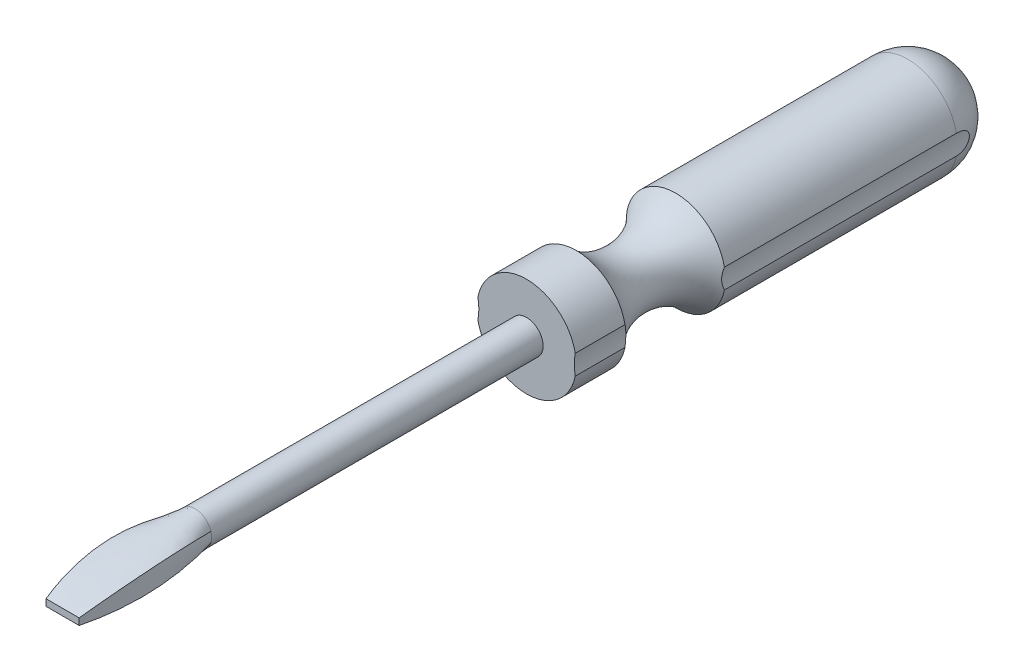
ISO-10303-21;
HEADER;
FILE_DESCRIPTION(('STEP AP214'),'2;1');
FILE_NAME('part.step','',(''),(''),'','','');
FILE_SCHEMA(('AUTOMOTIVE_DESIGN { 1 0 10303 214 1 1 1 1 }'));
ENDSEC;
DATA;
#1=APPLICATION_CONTEXT('core data for automotive mechanical design processes');
#2=APPLICATION_PROTOCOL_DEFINITION('international standard','automotive_design',2000,#1);
#3=PRODUCT_CONTEXT('',#1,'mechanical');
#4=PRODUCT('Part','Part','',(#3));
#5=PRODUCT_RELATED_PRODUCT_CATEGORY('part','',(#4));
#6=PRODUCT_DEFINITION_FORMATION('','',#4);
#7=PRODUCT_DEFINITION_CONTEXT('part definition',#1,'design');
#8=PRODUCT_DEFINITION('design','',#6,#7);
#9=PRODUCT_DEFINITION_SHAPE('','',#8);
#10=(LENGTH_UNIT() NAMED_UNIT(*) SI_UNIT(.MILLI.,.METRE.));
#11=(NAMED_UNIT(*) PLANE_ANGLE_UNIT() SI_UNIT($,.RADIAN.));
#12=(NAMED_UNIT(*) SI_UNIT($,.STERADIAN.) SOLID_ANGLE_UNIT());
#13=UNCERTAINTY_MEASURE_WITH_UNIT(LENGTH_MEASURE(1.E-05),#10,'distance_accuracy_value','');
#14=(GEOMETRIC_REPRESENTATION_CONTEXT(3) GLOBAL_UNCERTAINTY_ASSIGNED_CONTEXT((#13)) GLOBAL_UNIT_ASSIGNED_CONTEXT((#10,
#11,#12)) REPRESENTATION_CONTEXT('',''));
#15=CARTESIAN_POINT('',(0.,0.,0.));
#16=DIRECTION('',(0.,0.,1.));
#17=DIRECTION('',(1.,0.,0.));
#18=AXIS2_PLACEMENT_3D('',#15,#16,#17);
#19=CARTESIAN_POINT('',(0.,0.,0.));
#20=DIRECTION('',(0.,0.,1.));
#21=DIRECTION('',(1.,0.,0.));
#22=AXIS2_PLACEMENT_3D('',#19,#20,#21);
#23=CYLINDRICAL_SURFACE('',#22,19.05);
#24=DIRECTION('',(0.,0.,1.));
#25=VECTOR('',#24,1.);
#26=CARTESIAN_POINT('',(-18.669,-3.79090213537629,-82.55));
#27=LINE('',#26,#25);
#28=CARTESIAN_POINT('',(-18.669,-3.79090213537628,-146.05));
#29=VERTEX_POINT('',#28);
#30=CARTESIAN_POINT('',(-18.669,-3.79090213537627,-57.15));
#31=VERTEX_POINT('',#30);
#32=EDGE_CURVE('E134',#29,#31,#27,.T.);
#33=ORIENTED_EDGE('',*,*,#32,.F.);
#34=CARTESIAN_POINT('',(0.,0.,-146.05));
#35=DIRECTION('',(0.,0.,1.));
#36=DIRECTION('',(1.,0.,0.));
#37=AXIS2_PLACEMENT_3D('',#34,#35,#36);
#38=CIRCLE('',#37,19.05);
#39=CARTESIAN_POINT('',(18.669,-3.79090213537629,-146.05));
#40=VERTEX_POINT('',#39);
#41=EDGE_CURVE('E240',#29,#40,#38,.T.);
#42=ORIENTED_EDGE('',*,*,#41,.T.);
#43=DIRECTION('',(0.,0.,1.));
#44=VECTOR('',#43,1.);
#45=CARTESIAN_POINT('',(18.669,-3.79090213537629,-82.55));
#46=LINE('',#45,#44);
#47=CARTESIAN_POINT('',(18.669,-3.79090213537627,-57.15));
#48=VERTEX_POINT('',#47);
#49=EDGE_CURVE('E338',#48,#40,#46,.F.);
#50=ORIENTED_EDGE('',*,*,#49,.F.);
#51=CARTESIAN_POINT('',(0.,0.,-57.15));
#52=DIRECTION('',(0.,0.,1.));
#53=DIRECTION('',(1.,0.,0.));
#54=AXIS2_PLACEMENT_3D('',#51,#52,#53);
#55=CIRCLE('',#54,19.05);
#56=EDGE_CURVE('E236',#31,#48,#55,.T.);
#57=ORIENTED_EDGE('',*,*,#56,.F.);
#58=EDGE_LOOP('',(#33,#42,#50,#57));
#59=FACE_BOUND('',#58,.T.);
#60=ADVANCED_FACE('F115',(#59),#23,.T.);
#61=CARTESIAN_POINT('',(0.,0.,0.));
#62=DIRECTION('',(0.,0.,1.));
#63=DIRECTION('',(1.,0.,0.));
#64=AXIS2_PLACEMENT_3D('',#61,#62,#63);
#65=CYLINDRICAL_SURFACE('',#64,19.05);
#66=DIRECTION('',(0.,0.,1.));
#67=VECTOR('',#66,1.);
#68=CARTESIAN_POINT('',(-18.669,-3.79090213537627,-82.55));
#69=LINE('',#68,#67);
#70=CARTESIAN_POINT('',(-18.669,-3.79090213537627,-19.05));
#71=VERTEX_POINT('',#70);
#72=CARTESIAN_POINT('',(-18.669,-3.79090213537627,0.));
#73=VERTEX_POINT('',#72);
#74=EDGE_CURVE('E142',#71,#73,#69,.T.);
#75=ORIENTED_EDGE('',*,*,#74,.F.);
#76=CARTESIAN_POINT('',(0.,0.,-19.05));
#77=DIRECTION('',(0.,0.,1.));
#78=DIRECTION('',(1.,0.,0.));
#79=AXIS2_PLACEMENT_3D('',#76,#77,#78);
#80=CIRCLE('',#79,19.05);
#81=CARTESIAN_POINT('',(18.669,-3.79090213537628,-19.05));
#82=VERTEX_POINT('',#81);
#83=EDGE_CURVE('E229',#71,#82,#80,.T.);
#84=ORIENTED_EDGE('',*,*,#83,.T.);
#85=DIRECTION('',(0.,0.,1.));
#86=VECTOR('',#85,1.);
#87=CARTESIAN_POINT('',(18.669,-3.79090213537627,-82.55));
#88=LINE('',#87,#86);
#89=CARTESIAN_POINT('',(18.669,-3.79090213537627,0.));
#90=VERTEX_POINT('',#89);
#91=EDGE_CURVE('E331',#90,#82,#88,.F.);
#92=ORIENTED_EDGE('',*,*,#91,.F.);
#93=CARTESIAN_POINT('',(0.,0.,0.));
#94=DIRECTION('',(0.,0.,1.));
#95=DIRECTION('',(1.,0.,0.));
#96=AXIS2_PLACEMENT_3D('',#93,#94,#95);
#97=CIRCLE('',#96,19.05);
#98=EDGE_CURVE('E230',#73,#90,#97,.T.);
#99=ORIENTED_EDGE('',*,*,#98,.F.);
#100=EDGE_LOOP('',(#75,#84,#92,#99));
#101=FACE_BOUND('',#100,.T.);
#102=ADVANCED_FACE('F275',(#101),#65,.T.);
#103=CARTESIAN_POINT('',(0.,0.,-146.05));
#104=DIRECTION('',(0.,0.,1.));
#105=DIRECTION('',(1.,0.,0.));
#106=AXIS2_PLACEMENT_3D('',#103,#104,#105);
#107=SPHERICAL_SURFACE('',#106,19.05);
#108=CARTESIAN_POINT('',(-18.6689999994643,3.79090213273839,-146.0498));
#109=CARTESIAN_POINT('',(-18.6690071271288,3.79088999789261,-146.211644604817));
#110=CARTESIAN_POINT('',(-18.6679495154093,3.78572753663687,-146.373493722282));
#111=CARTESIAN_POINT('',(-18.6637499771026,3.76498234499913,-146.696554383145));
#112=CARTESIAN_POINT('',(-18.6606072759299,3.74939574215745,-146.857765667199));
#113=CARTESIAN_POINT('',(-18.6522465553277,3.70750094111438,-147.180179834258));
#114=CARTESIAN_POINT('',(-18.6470107095209,3.68110059834242,-147.341370429586));
#115=CARTESIAN_POINT('',(-18.634569811888,3.61735073544547,-147.661449227257));
#116=CARTESIAN_POINT('',(-18.6273649544462,3.58000229610881,-147.820337655243));
#117=CARTESIAN_POINT('',(-18.6029563206619,3.45088250527043,-148.292962284711));
#118=CARTESIAN_POINT('',(-18.5829723561555,3.34210049017128,-148.602146420427));
#119=CARTESIAN_POINT('',(-18.5374917114641,3.0759771398944,-149.19780351255));
#120=CARTESIAN_POINT('',(-18.5120135355995,2.91879806210983,-149.48434839564));
#121=CARTESIAN_POINT('',(-18.4673978860258,2.61120980292474,-149.934339401585));
#122=CARTESIAN_POINT('',(-18.4488785044472,2.47508740501459,-150.107602211994));
#123=CARTESIAN_POINT('',(-18.4122957814189,2.1777564892578,-150.431288380296));
#124=CARTESIAN_POINT('',(-18.3942319169091,2.01657842392208,-150.58173903116));
#125=CARTESIAN_POINT('',(-18.3637632788816,1.7031078802907,-150.825543426207));
#126=CARTESIAN_POINT('',(-18.3509388591905,1.55509189369464,-150.924312954777));
#127=CARTESIAN_POINT('',(-18.3280683534521,1.24464723721031,-151.096467799434));
#128=CARTESIAN_POINT('',(-18.3180206935678,1.0822268008512,-151.169867500798));
#129=CARTESIAN_POINT('',(-18.3018237959273,0.745074052605655,-151.28667454718));
#130=CARTESIAN_POINT('',(-18.295707221825,0.570251654658885,-151.329830858341));
#131=CARTESIAN_POINT('',(-18.2883952538654,0.21546022955117,-151.381300229145));
#132=CARTESIAN_POINT('',(-18.2871959820888,0.0354953707141862,-151.389640745571));
#133=CARTESIAN_POINT('',(-18.2897046906281,-0.298492080805676,-151.372053727303));
#134=CARTESIAN_POINT('',(-18.2927793693321,-0.452772719864009,-151.350549237501));
#135=CARTESIAN_POINT('',(-18.3023856059404,-0.755533460464586,-151.282441634476));
#136=CARTESIAN_POINT('',(-18.3089175083899,-0.904012982286244,-151.235836019679));
#137=CARTESIAN_POINT('',(-18.3248680535448,-1.19358684848697,-151.119690986253));
#138=CARTESIAN_POINT('',(-18.334321584771,-1.33456639106742,-151.049873576946));
#139=CARTESIAN_POINT('',(-18.355249571516,-1.60502945403989,-150.891068688905));
#140=CARTESIAN_POINT('',(-18.366724992962,-1.73450743506522,-150.802072043028));
#141=CARTESIAN_POINT('',(-18.3968928216264,-2.04241309249994,-150.56007354898));
#142=CARTESIAN_POINT('',(-18.4163323145103,-2.21308723821448,-150.397274617158));
#143=CARTESIAN_POINT('',(-18.4555506783996,-2.52597782739866,-150.046316221464));
#144=CARTESIAN_POINT('',(-18.4753302188093,-2.66812888717266,-149.858100107883));
#145=CARTESIAN_POINT('',(-18.5205668164731,-2.97299655499462,-149.390254029699));
#146=CARTESIAN_POINT('',(-18.5453907883907,-3.12361721665567,-149.1027070365));
#147=CARTESIAN_POINT('',(-18.5893699387015,-3.37756372182871,-148.506756937012));
#148=CARTESIAN_POINT('',(-18.6085123668663,-3.48078347028035,-148.198308801077));
#149=CARTESIAN_POINT('',(-18.6313176600187,-3.60055110052495,-147.734235916944));
#150=CARTESIAN_POINT('',(-18.6378437492045,-3.63421080545108,-147.58292591926));
#151=CARTESIAN_POINT('',(-18.649104827508,-3.6916907550241,-147.278347730451));
#152=CARTESIAN_POINT('',(-18.6538397342646,-3.71551054722334,-147.125079449615));
#153=CARTESIAN_POINT('',(-18.6614055096747,-3.75335843750209,-146.818414420967));
#154=CARTESIAN_POINT('',(-18.6642496877177,-3.76745500719658,-146.665026348463));
#155=CARTESIAN_POINT('',(-18.6680496350018,-3.78622090549569,-146.357691113659));
#156=CARTESIAN_POINT('',(-18.6690059078321,-3.79089274810601,-146.20374411143));
#157=CARTESIAN_POINT('',(-18.6689999994643,-3.79090213273838,-146.0498));
#158=B_SPLINE_CURVE_WITH_KNOTS('',3,(#108,#109,#110,#111,#112,#113,#114,#115,#116,#117,#118,
#119,#120,#121,#122,#123,#124,#125,#126,#127,#128,#129,#130,#131,#132,#133,#134,#135,#136,#137,
#138,#139,#140,#141,#142,#143,#144,#145,#146,#147,#148,#149,#150,#151,#152,#153,#154,#155,#156,
#157),.UNSPECIFIED.,.F.,.F.,(4,2,2,2,2,2,2,2,2,2,2,2,2,2,2,2,2,2,2,2,2,2,2,2,4),(0.,
0.48545322286588,0.97108688677885,1.46094772170914,1.95076021420127,2.93191797353359,
3.90982144649461,4.57108791373526,5.23155687621044,5.76470791369379,6.29755614436796,
6.83477648284016,7.37157307306591,7.83675913807519,8.30199157203833,8.77300950072448,
9.24425306423248,9.95029026755337,10.6579278867133,11.6294279019886,12.6030919033681,
13.068265292295,13.5334600679143,13.9953445129185,14.4571057359197),.UNSPECIFIED.);
#159=CARTESIAN_POINT('',(-18.669,3.79090213537629,-146.05));
#160=VERTEX_POINT('',#159);
#161=EDGE_CURVE('E325',#160,#29,#158,.T.);
#162=ORIENTED_EDGE('',*,*,#161,.F.);
#163=CARTESIAN_POINT('',(18.669,3.79090213537629,-146.05));
#164=VERTEX_POINT('',#163);
#165=EDGE_CURVE('E126',#164,#160,#38,.T.);
#166=ORIENTED_EDGE('',*,*,#165,.F.);
#167=CARTESIAN_POINT('',(18.6689999994643,-3.79090213273839,-146.0498));
#168=CARTESIAN_POINT('',(18.6690071271288,-3.7908899978926,-146.211644604817));
#169=CARTESIAN_POINT('',(18.6679495154093,-3.78572753663687,-146.373493722282));
#170=CARTESIAN_POINT('',(18.6637499771026,-3.76498234499913,-146.696554383145));
#171=CARTESIAN_POINT('',(18.6606072759299,-3.74939574215746,-146.857765667199));
#172=CARTESIAN_POINT('',(18.6522465553277,-3.70750094111438,-147.180179834258));
#173=CARTESIAN_POINT('',(18.6470107095209,-3.68110059834242,-147.341370429586));
#174=CARTESIAN_POINT('',(18.634569811888,-3.61735073544547,-147.661449227257));
#175=CARTESIAN_POINT('',(18.6273649544462,-3.58000229610882,-147.820337655243));
#176=CARTESIAN_POINT('',(18.6029563206619,-3.45088250527046,-148.292962284711));
#177=CARTESIAN_POINT('',(18.5829723561555,-3.3421004901713,-148.602146420427));
#178=CARTESIAN_POINT('',(18.5374917114641,-3.07597713989442,-149.19780351255));
#179=CARTESIAN_POINT('',(18.5120135355995,-2.91879806210986,-149.48434839564));
#180=CARTESIAN_POINT('',(18.4673978860258,-2.61120980292476,-149.934339401585));
#181=CARTESIAN_POINT('',(18.4488785044472,-2.4750874050146,-150.107602211993));
#182=CARTESIAN_POINT('',(18.4122957814189,-2.1777564892578,-150.431288380296));
#183=CARTESIAN_POINT('',(18.3942319169091,-2.01657842392208,-150.58173903116));
#184=CARTESIAN_POINT('',(18.3637632788816,-1.70310788029071,-150.825543426207));
#185=CARTESIAN_POINT('',(18.3509388591905,-1.55509189369464,-150.924312954777));
#186=CARTESIAN_POINT('',(18.3280683534521,-1.24464723721031,-151.096467799434));
#187=CARTESIAN_POINT('',(18.3180206935678,-1.0822268008512,-151.169867500798));
#188=CARTESIAN_POINT('',(18.3018237959273,-0.745074052605654,-151.28667454718));
#189=CARTESIAN_POINT('',(18.295707221825,-0.570251654658882,-151.329830858341));
#190=CARTESIAN_POINT('',(18.2883952538654,-0.215460229551165,-151.381300229145));
#191=CARTESIAN_POINT('',(18.2871959820888,-0.0354953707141827,-151.389640745571));
#192=CARTESIAN_POINT('',(18.2897046906281,0.298492080805679,-151.372053727303));
#193=CARTESIAN_POINT('',(18.2927793693321,0.452772719864012,-151.350549237501));
#194=CARTESIAN_POINT('',(18.3023856059404,0.755533460464589,-151.282441634476));
#195=CARTESIAN_POINT('',(18.3089175083899,0.904012982286247,-151.235836019679));
#196=CARTESIAN_POINT('',(18.3248680535448,1.19358684848697,-151.119690986253));
#197=CARTESIAN_POINT('',(18.334321584771,1.33456639106742,-151.049873576946));
#198=CARTESIAN_POINT('',(18.355249571516,1.60502945403989,-150.891068688905));
#199=CARTESIAN_POINT('',(18.366724992962,1.73450743506523,-150.802072043028));
#200=CARTESIAN_POINT('',(18.3968928216264,2.04241309249994,-150.56007354898));
#201=CARTESIAN_POINT('',(18.4163323145103,2.21308723821448,-150.397274617158));
#202=CARTESIAN_POINT('',(18.4555506783996,2.52597782739866,-150.046316221464));
#203=CARTESIAN_POINT('',(18.4753302188093,2.66812888717266,-149.858100107883));
#204=CARTESIAN_POINT('',(18.5205668164731,2.97299655499462,-149.390254029699));
#205=CARTESIAN_POINT('',(18.5453907883907,3.12361721665567,-149.1027070365));
#206=CARTESIAN_POINT('',(18.5893699387015,3.3775637218287,-148.506756937012));
#207=CARTESIAN_POINT('',(18.6085123668663,3.48078347028033,-148.198308801077));
#208=CARTESIAN_POINT('',(18.6313176600187,3.60055110052494,-147.734235916944));
#209=CARTESIAN_POINT('',(18.6378437492045,3.63421080545108,-147.58292591926));
#210=CARTESIAN_POINT('',(18.649104827508,3.69169075502411,-147.278347730451));
#211=CARTESIAN_POINT('',(18.6538397342646,3.71551054722334,-147.125079449615));
#212=CARTESIAN_POINT('',(18.6614055096747,3.75335843750208,-146.818414420967));
#213=CARTESIAN_POINT('',(18.6642496877177,3.76745500719658,-146.665026348463));
#214=CARTESIAN_POINT('',(18.6680496350018,3.78622090549569,-146.357691113659));
#215=CARTESIAN_POINT('',(18.6690059078321,3.79089274810601,-146.20374411143));
#216=CARTESIAN_POINT('',(18.6689999994643,3.79090213273838,-146.0498));
#217=B_SPLINE_CURVE_WITH_KNOTS('',3,(#167,#168,#169,#170,#171,#172,#173,#174,#175,#176,#177,
#178,#179,#180,#181,#182,#183,#184,#185,#186,#187,#188,#189,#190,#191,#192,#193,#194,#195,#196,
#197,#198,#199,#200,#201,#202,#203,#204,#205,#206,#207,#208,#209,#210,#211,#212,#213,#214,#215,
#216),.UNSPECIFIED.,.F.,.F.,(4,2,2,2,2,2,2,2,2,2,2,2,2,2,2,2,2,2,2,2,2,2,2,2,4),(0.,
0.485453222865852,0.97108688677885,1.46094772170914,1.95076021420124,2.93191797353352,
3.90982144649458,4.57108791373523,5.23155687621044,5.76470791369378,6.29755614436796,
6.83477648284017,7.37157307306591,7.83675913807519,8.30199157203833,8.77300950072448,
9.24425306423248,9.95029026755336,10.6579278867133,11.6294279019886,12.6030919033681,
13.0682652922949,13.5334600679143,13.9953445129184,14.4571057359197),.UNSPECIFIED.);
#218=EDGE_CURVE('E345',#40,#164,#217,.T.);
#219=ORIENTED_EDGE('',*,*,#218,.F.);
#220=ORIENTED_EDGE('',*,*,#41,.F.);
#221=EDGE_LOOP('',(#162,#166,#219,#220));
#222=FACE_BOUND('',#221,.T.);
#223=ADVANCED_FACE('F117',(#222),#107,.T.);
#224=DIRECTION('',(0.,0.,1.));
#225=VECTOR('',#224,1.);
#226=CARTESIAN_POINT('',(-18.669,3.79090213537629,-82.55));
#227=LINE('',#226,#225);
#228=CARTESIAN_POINT('',(-18.669,3.79090213537627,-57.15));
#229=VERTEX_POINT('',#228);
#230=EDGE_CURVE('E323',#229,#160,#227,.F.);
#231=ORIENTED_EDGE('',*,*,#230,.F.);
#232=CARTESIAN_POINT('',(18.669,3.79090213537627,-57.15));
#233=VERTEX_POINT('',#232);
#234=EDGE_CURVE('E237',#233,#229,#55,.T.);
#235=ORIENTED_EDGE('',*,*,#234,.F.);
#236=DIRECTION('',(0.,0.,1.));
#237=VECTOR('',#236,1.);
#238=CARTESIAN_POINT('',(18.669,3.79090213537629,-82.55));
#239=LINE('',#238,#237);
#240=EDGE_CURVE('E343',#164,#233,#239,.T.);
#241=ORIENTED_EDGE('',*,*,#240,.F.);
#242=ORIENTED_EDGE('',*,*,#165,.T.);
#243=EDGE_LOOP('',(#231,#235,#241,#242));
#244=FACE_BOUND('',#243,.T.);
#245=ADVANCED_FACE('F278',(#244),#23,.T.);
#246=CARTESIAN_POINT('',(0.,0.,-38.1));
#247=DIRECTION('',(0.,0.,1.));
#248=DIRECTION('',(1.,0.,0.));
#249=AXIS2_PLACEMENT_3D('',#246,#247,#248);
#250=TOROIDAL_SURFACE('',#249,35.8505208252601,25.4);
#251=CARTESIAN_POINT('',(-18.6691157054871,3.79147190390352,-19.0498));
#252=CARTESIAN_POINT('',(-18.6175335441774,3.53752339042403,-19.1389741813071));
#253=CARTESIAN_POINT('',(-18.5706906776839,3.28026611621832,-19.2220742478415));
#254=CARTESIAN_POINT('',(-18.4870382146051,2.75924370525716,-19.3731713584943));
#255=CARTESIAN_POINT('',(-18.4502478503495,2.49546713225397,-19.4411394068574));
#256=CARTESIAN_POINT('',(-18.3876104596375,1.9637968797605,-19.5583660184935));
#257=CARTESIAN_POINT('',(-18.3617104674136,1.69592985110014,-19.6077150129295));
#258=CARTESIAN_POINT('',(-18.3212139610214,1.15647416824545,-19.6854501629535));
#259=CARTESIAN_POINT('',(-18.3066093524519,0.884888321302011,-19.7138513293173));
#260=CARTESIAN_POINT('',(-18.2889910132325,0.337065509628985,-19.7481636868365));
#261=CARTESIAN_POINT('',(-18.2860988295006,0.0608095001609568,-19.7538390316499));
#262=CARTESIAN_POINT('',(-18.2923312139906,-0.491115692800349,-19.7416662105621));
#263=CARTESIAN_POINT('',(-18.3014592257017,-0.766784685464226,-19.7238113038238));
#264=CARTESIAN_POINT('',(-18.3314553789216,-1.31495823481329,-19.6657531007226));
#265=CARTESIAN_POINT('',(-18.3523191986945,-1.58746391871199,-19.6255580312362));
#266=CARTESIAN_POINT('',(-18.4052336393389,-2.12755489940835,-19.5252256893681));
#267=CARTESIAN_POINT('',(-18.4372816836685,-2.39514131453893,-19.4650930102297));
#268=CARTESIAN_POINT('',(-18.5016731516211,-2.85183462011283,-19.3467398046389));
#269=CARTESIAN_POINT('',(-18.5315298401966,-3.04235649041762,-19.2925094559271));
#270=CARTESIAN_POINT('',(-18.5964646826414,-3.41963120976202,-19.1765142959775));
#271=CARTESIAN_POINT('',(-18.6315287916438,-3.60639270790405,-19.1147698294486));
#272=CARTESIAN_POINT('',(-18.6691157054871,-3.79147190390353,-19.0498));
#273=B_SPLINE_CURVE_WITH_KNOTS('',3,(#251,#252,#253,#254,#255,#256,#257,#258,#259,#260,#261,
#262,#263,#264,#265,#266,#267,#268,#269,#270,#271,#272),.UNSPECIFIED.,.F.,.F.,(4,2,2,2,2,2,2,2,
2,2,4),(0.,0.822317124305652,1.64619665228669,2.46602151666855,3.28525833941503,
4.11297542389422,4.94092968047048,5.76857924057672,6.59603825841654,7.19678452693626,
7.79593900597302),.UNSPECIFIED.);
#274=CARTESIAN_POINT('',(-18.669,3.79090213537627,-19.05));
#275=VERTEX_POINT('',#274);
#276=EDGE_CURVE('E222',#275,#71,#273,.T.);
#277=ORIENTED_EDGE('',*,*,#276,.F.);
#278=CARTESIAN_POINT('',(18.669,3.79090213537627,-19.05));
#279=VERTEX_POINT('',#278);
#280=EDGE_CURVE('E221',#279,#275,#80,.T.);
#281=ORIENTED_EDGE('',*,*,#280,.F.);
#282=CARTESIAN_POINT('',(18.6691157054871,-3.79147190390353,-19.0498));
#283=CARTESIAN_POINT('',(18.6175335441774,-3.53752339042404,-19.1389741813071));
#284=CARTESIAN_POINT('',(18.5706906776839,-3.28026611621832,-19.2220742478415));
#285=CARTESIAN_POINT('',(18.4870382146051,-2.75924370525716,-19.3731713584943));
#286=CARTESIAN_POINT('',(18.4502478503495,-2.49546713225397,-19.4411394068574));
#287=CARTESIAN_POINT('',(18.3876104596375,-1.9637968797605,-19.5583660184935));
#288=CARTESIAN_POINT('',(18.3617104674136,-1.69592985110015,-19.6077150129295));
#289=CARTESIAN_POINT('',(18.3212139610214,-1.15647416824546,-19.6854501629535));
#290=CARTESIAN_POINT('',(18.3066093524519,-0.884888321302018,-19.7138513293173));
#291=CARTESIAN_POINT('',(18.2889910132325,-0.337065509628992,-19.7481636868365));
#292=CARTESIAN_POINT('',(18.2860988295006,-0.0608095001609634,-19.7538390316499));
#293=CARTESIAN_POINT('',(18.2923312139906,0.491115692800343,-19.7416662105621));
#294=CARTESIAN_POINT('',(18.3014592257017,0.76678468546422,-19.7238113038239));
#295=CARTESIAN_POINT('',(18.3314553789216,1.31495823481328,-19.6657531007226));
#296=CARTESIAN_POINT('',(18.3523191986945,1.58746391871199,-19.6255580312362));
#297=CARTESIAN_POINT('',(18.4052336393389,2.12755489940834,-19.5252256893681));
#298=CARTESIAN_POINT('',(18.4372816836685,2.39514131453892,-19.4650930102297));
#299=CARTESIAN_POINT('',(18.5016731516211,2.85183462011282,-19.3467398046389));
#300=CARTESIAN_POINT('',(18.5315298401966,3.04235649041761,-19.2925094559271));
#301=CARTESIAN_POINT('',(18.5964646826414,3.41963120976201,-19.1765142959775));
#302=CARTESIAN_POINT('',(18.6315287916438,3.60639270790404,-19.1147698294486));
#303=CARTESIAN_POINT('',(18.6691157054871,3.79147190390352,-19.0498));
#304=B_SPLINE_CURVE_WITH_KNOTS('',3,(#282,#283,#284,#285,#286,#287,#288,#289,#290,#291,#292,
#293,#294,#295,#296,#297,#298,#299,#300,#301,#302,#303),.UNSPECIFIED.,.F.,.F.,(4,2,2,2,2,2,2,2,
2,2,4),(0.,0.822317124305651,1.64619665228669,2.46602151666855,3.28525833941503,
4.11297542389422,4.94092968047048,5.76857924057672,6.59603825841653,7.19678452693626,
7.79593900597302),.UNSPECIFIED.);
#305=EDGE_CURVE('E283',#82,#279,#304,.T.);
#306=ORIENTED_EDGE('',*,*,#305,.F.);
#307=ORIENTED_EDGE('',*,*,#83,.F.);
#308=EDGE_LOOP('',(#277,#281,#306,#307));
#309=FACE_BOUND('',#308,.T.);
#310=CARTESIAN_POINT('',(-18.6691157054871,-3.79147190390352,-57.1502));
#311=CARTESIAN_POINT('',(-18.6175335441774,-3.53752339042403,-57.0610258186929));
#312=CARTESIAN_POINT('',(-18.5706906776839,-3.28026611621832,-56.9779257521585));
#313=CARTESIAN_POINT('',(-18.4870382146051,-2.75924370525716,-56.8268286415057));
#314=CARTESIAN_POINT('',(-18.4502478503495,-2.49546713225396,-56.7588605931426));
#315=CARTESIAN_POINT('',(-18.3876104596375,-1.96379687976049,-56.6416339815065));
#316=CARTESIAN_POINT('',(-18.3617104674136,-1.69592985110013,-56.5922849870705));
#317=CARTESIAN_POINT('',(-18.3212139610214,-1.15647416824544,-56.5145498370465));
#318=CARTESIAN_POINT('',(-18.3066093524519,-0.884888321302006,-56.4861486706827));
#319=CARTESIAN_POINT('',(-18.2889910132325,-0.337065509628981,-56.4518363131635));
#320=CARTESIAN_POINT('',(-18.2860988295006,-0.0608095001609527,-56.4461609683501));
#321=CARTESIAN_POINT('',(-18.2923312139906,0.491115692800354,-56.4583337894379));
#322=CARTESIAN_POINT('',(-18.3014592257017,0.766784685464231,-56.4761886961762));
#323=CARTESIAN_POINT('',(-18.3314553789216,1.31495823481329,-56.5342468992774));
#324=CARTESIAN_POINT('',(-18.3523191986945,1.587463918712,-56.5744419687638));
#325=CARTESIAN_POINT('',(-18.4052336393389,2.12755489940836,-56.6747743106319));
#326=CARTESIAN_POINT('',(-18.4372816836685,2.39514131453894,-56.7349069897703));
#327=CARTESIAN_POINT('',(-18.5016731516211,2.85183462011283,-56.8532601953611));
#328=CARTESIAN_POINT('',(-18.5315298401966,3.04235649041762,-56.9074905440729));
#329=CARTESIAN_POINT('',(-18.5964646826414,3.41963120976202,-57.0234857040225));
#330=CARTESIAN_POINT('',(-18.6315287916438,3.60639270790404,-57.0852301705514));
#331=CARTESIAN_POINT('',(-18.6691157054871,3.79147190390352,-57.1502));
#332=B_SPLINE_CURVE_WITH_KNOTS('',3,(#310,#311,#312,#313,#314,#315,#316,#317,#318,#319,#320,
#321,#322,#323,#324,#325,#326,#327,#328,#329,#330,#331),.UNSPECIFIED.,.F.,.F.,(4,2,2,2,2,2,2,2,
2,2,4),(0.,0.822317124305652,1.64619665228669,2.46602151666855,3.28525833941503,
4.11297542389422,4.94092968047048,5.76857924057672,6.59603825841654,7.19678452693625,
7.79593900597301),.UNSPECIFIED.);
#333=EDGE_CURVE('E317',#31,#229,#332,.T.);
#334=ORIENTED_EDGE('',*,*,#333,.F.);
#335=ORIENTED_EDGE('',*,*,#56,.T.);
#336=CARTESIAN_POINT('',(18.6691157054871,3.79147190390352,-57.1502));
#337=CARTESIAN_POINT('',(18.6175335441774,3.53752339042403,-57.0610258186929));
#338=CARTESIAN_POINT('',(18.5706906776839,3.28026611621831,-56.9779257521585));
#339=CARTESIAN_POINT('',(18.4870382146051,2.75924370525715,-56.8268286415057));
#340=CARTESIAN_POINT('',(18.4502478503495,2.49546713225396,-56.7588605931426));
#341=CARTESIAN_POINT('',(18.3876104596375,1.96379687976049,-56.6416339815065));
#342=CARTESIAN_POINT('',(18.3617104674136,1.69592985110013,-56.5922849870705));
#343=CARTESIAN_POINT('',(18.3212139610214,1.15647416824545,-56.5145498370465));
#344=CARTESIAN_POINT('',(18.3066093524519,0.884888321302006,-56.4861486706827));
#345=CARTESIAN_POINT('',(18.2889910132325,0.337065509628981,-56.4518363131635));
#346=CARTESIAN_POINT('',(18.2860988295006,0.0608095001609519,-56.4461609683501));
#347=CARTESIAN_POINT('',(18.2923312139906,-0.491115692800354,-56.4583337894379));
#348=CARTESIAN_POINT('',(18.3014592257017,-0.766784685464231,-56.4761886961762));
#349=CARTESIAN_POINT('',(18.3314553789216,-1.31495823481329,-56.5342468992774));
#350=CARTESIAN_POINT('',(18.3523191986945,-1.587463918712,-56.5744419687638));
#351=CARTESIAN_POINT('',(18.4052336393389,-2.12755489940836,-56.6747743106319));
#352=CARTESIAN_POINT('',(18.4372816836685,-2.39514131453893,-56.7349069897703));
#353=CARTESIAN_POINT('',(18.5016731516211,-2.85183462011283,-56.8532601953611));
#354=CARTESIAN_POINT('',(18.5315298401966,-3.04235649041762,-56.9074905440729));
#355=CARTESIAN_POINT('',(18.5964646826414,-3.41963120976202,-57.0234857040225));
#356=CARTESIAN_POINT('',(18.6315287916438,-3.60639270790405,-57.0852301705514));
#357=CARTESIAN_POINT('',(18.6691157054871,-3.79147190390352,-57.1502));
#358=B_SPLINE_CURVE_WITH_KNOTS('',3,(#336,#337,#338,#339,#340,#341,#342,#343,#344,#345,#346,
#347,#348,#349,#350,#351,#352,#353,#354,#355,#356,#357),.UNSPECIFIED.,.F.,.F.,(4,2,2,2,2,2,2,2,
2,2,4),(0.,0.822317124305651,1.64619665228669,2.46602151666855,3.28525833941503,
4.11297542389422,4.94092968047048,5.76857924057672,6.59603825841654,7.19678452693625,
7.79593900597301),.UNSPECIFIED.);
#359=EDGE_CURVE('E294',#233,#48,#358,.T.);
#360=ORIENTED_EDGE('',*,*,#359,.F.);
#361=ORIENTED_EDGE('',*,*,#234,.T.);
#362=EDGE_LOOP('',(#334,#335,#360,#361));
#363=FACE_BOUND('',#362,.T.);
#364=ADVANCED_FACE('F274',(#309,#363),#250,.F.);
#365=DIRECTION('',(0.,0.,1.));
#366=VECTOR('',#365,1.);
#367=CARTESIAN_POINT('',(-18.669,3.79090213537627,-82.55));
#368=LINE('',#367,#366);
#369=CARTESIAN_POINT('',(-18.669,3.79090213537627,0.));
#370=VERTEX_POINT('',#369);
#371=EDGE_CURVE('E208',#370,#275,#368,.F.);
#372=ORIENTED_EDGE('',*,*,#371,.F.);
#373=CARTESIAN_POINT('',(18.669,3.79090213537627,0.));
#374=VERTEX_POINT('',#373);
#375=EDGE_CURVE('E219',#374,#370,#97,.T.);
#376=ORIENTED_EDGE('',*,*,#375,.F.);
#377=DIRECTION('',(0.,0.,1.));
#378=VECTOR('',#377,1.);
#379=CARTESIAN_POINT('',(18.669,3.79090213537627,-82.55));
#380=LINE('',#379,#378);
#381=EDGE_CURVE('E336',#279,#374,#380,.T.);
#382=ORIENTED_EDGE('',*,*,#381,.F.);
#383=ORIENTED_EDGE('',*,*,#280,.T.);
#384=EDGE_LOOP('',(#372,#376,#382,#383));
#385=FACE_BOUND('',#384,.T.);
#386=ADVANCED_FACE('F217',(#385),#65,.T.);
#387=CARTESIAN_POINT('',(0.,0.,0.));
#388=DIRECTION('',(0.,0.,1.));
#389=DIRECTION('',(1.,0.,0.));
#390=AXIS2_PLACEMENT_3D('',#387,#388,#389);
#391=PLANE('',#390);
#392=CARTESIAN_POINT('',(-37.338,0.,0.));
#393=DIRECTION('',(0.,0.,1.));
#394=DIRECTION('',(-1.,0.,0.));
#395=AXIS2_PLACEMENT_3D('',#392,#393,#394);
#396=CIRCLE('',#395,19.05);
#397=EDGE_CURVE('E205',#73,#370,#396,.T.);
#398=ORIENTED_EDGE('',*,*,#397,.F.);
#399=ORIENTED_EDGE('',*,*,#98,.T.);
#400=CARTESIAN_POINT('',(37.338,0.,0.));
#401=DIRECTION('',(0.,0.,1.));
#402=DIRECTION('',(1.,0.,0.));
#403=AXIS2_PLACEMENT_3D('',#400,#401,#402);
#404=CIRCLE('',#403,19.05);
#405=EDGE_CURVE('E228',#374,#90,#404,.T.);
#406=ORIENTED_EDGE('',*,*,#405,.F.);
#407=ORIENTED_EDGE('',*,*,#375,.T.);
#408=EDGE_LOOP('',(#398,#399,#406,#407));
#409=FACE_BOUND('',#408,.T.);
#410=CARTESIAN_POINT('',(0.,0.,0.));
#411=DIRECTION('',(0.,0.,1.));
#412=DIRECTION('',(1.,0.,0.));
#413=AXIS2_PLACEMENT_3D('',#410,#411,#412);
#414=CIRCLE('',#413,6.35);
#415=CARTESIAN_POINT('',(6.35,0.,0.));
#416=VERTEX_POINT('',#415);
#417=EDGE_CURVE('E12',#416,#416,#414,.T.);
#418=ORIENTED_EDGE('',*,*,#417,.F.);
#419=EDGE_LOOP('',(#418));
#420=FACE_BOUND('',#419,.T.);
#421=ADVANCED_FACE('F225',(#409,#420),#391,.T.);
#422=CARTESIAN_POINT('',(0.,0.,127.));
#423=DIRECTION('',(0.,0.,-1.));
#424=DIRECTION('',(-1.,0.,0.));
#425=AXIS2_PLACEMENT_3D('',#422,#423,#424);
#426=CYLINDRICAL_SURFACE('',#425,6.35);
#427=CARTESIAN_POINT('',(6.06423657555215,1.88349004662502,127.));
#428=CARTESIAN_POINT('',(5.85804113848447,2.54737351838447,127.));
#429=CARTESIAN_POINT('',(5.2417074743179,3.76863298969801,127.));
#430=CARTESIAN_POINT('',(4.06203593613262,4.959116769684,127.));
#431=CARTESIAN_POINT('',(2.9350428536617,5.65907860035766,127.));
#432=CARTESIAN_POINT('',(1.71223348435847,6.18054823227698,127.));
#433=CARTESIAN_POINT('',(-0.000193322838778175,6.46351838530498,127.));
#434=CARTESIAN_POINT('',(-1.71185651781168,6.18061152104129,127.));
#435=CARTESIAN_POINT('',(-2.935103628648,5.65908154799098,127.));
#436=CARTESIAN_POINT('',(-4.06188804313585,4.95920080897503,127.));
#437=CARTESIAN_POINT('',(-5.24179598211128,3.7685821159294,127.));
#438=CARTESIAN_POINT('',(-5.85804113848447,2.54737351838447,127.));
#439=CARTESIAN_POINT('',(-6.06423657555215,1.88349004662501,127.));
#440=B_SPLINE_CURVE_WITH_KNOTS('',3,(#427,#428,#429,#430,#431,#432,#433,#434,#435,#436,#437,
#438,#439),.UNSPECIFIED.,.F.,.F.,(4,1,1,1,1,1,1,1,1,1,4),(0.,0.125,0.25,0.3125,0.375,0.5,0.625,
0.6875,0.75,0.875,1.),.UNSPECIFIED.);
#441=CARTESIAN_POINT('',(6.06427068664734,1.88350064960726,127.));
#442=VERTEX_POINT('',#441);
#443=CARTESIAN_POINT('',(-6.06427243663805,1.88350118339388,127.));
#444=VERTEX_POINT('',#443);
#445=EDGE_CURVE('E233',#442,#444,#440,.T.);
#446=ORIENTED_EDGE('',*,*,#445,.F.);
#447=CARTESIAN_POINT('',(0.,0.,127.));
#448=DIRECTION('',(0.,0.,-1.));
#449=DIRECTION('',(1.,0.,0.));
#450=AXIS2_PLACEMENT_3D('',#447,#448,#449);
#451=CIRCLE('',#450,6.35);
#452=CARTESIAN_POINT('',(6.06427243663801,-1.88350118339387,127.));
#453=VERTEX_POINT('',#452);
#454=EDGE_CURVE('E382',#453,#442,#451,.F.);
#455=ORIENTED_EDGE('',*,*,#454,.F.);
#456=CARTESIAN_POINT('',(0.,0.,127.));
#457=DIRECTION('',(0.,0.,1.));
#458=DIRECTION('',(1.,0.,0.));
#459=AXIS2_PLACEMENT_3D('',#456,#457,#458);
#460=CIRCLE('',#459,6.35);
#461=CARTESIAN_POINT('',(-6.06427068664692,-1.88350064960712,127.));
#462=VERTEX_POINT('',#461);
#463=EDGE_CURVE('E120',#462,#453,#460,.T.);
#464=ORIENTED_EDGE('',*,*,#463,.F.);
#465=CARTESIAN_POINT('',(0.,0.,127.));
#466=DIRECTION('',(0.,0.,1.));
#467=DIRECTION('',(1.,0.,0.));
#468=AXIS2_PLACEMENT_3D('',#465,#466,#467);
#469=CIRCLE('',#468,6.35);
#470=EDGE_CURVE('E371',#444,#462,#469,.T.);
#471=ORIENTED_EDGE('',*,*,#470,.F.);
#472=EDGE_LOOP('',(#446,#455,#464,#471));
#473=FACE_BOUND('',#472,.T.);
#474=ORIENTED_EDGE('',*,*,#417,.T.);
#475=EDGE_LOOP('',(#474));
#476=FACE_BOUND('',#475,.T.);
#477=ADVANCED_FACE('F254',(#473,#476),#426,.T.);
#478=CARTESIAN_POINT('',(0.,0.,177.8));
#479=DIRECTION('',(0.,0.,1.));
#480=DIRECTION('',(1.,0.,0.));
#481=AXIS2_PLACEMENT_3D('',#478,#479,#480);
#482=PLANE('',#481);
#483=DIRECTION('',(0.,1.,0.));
#484=VECTOR('',#483,1.);
#485=CARTESIAN_POINT('',(6.35000000000001,-1.27,177.8));
#486=LINE('',#485,#484);
#487=CARTESIAN_POINT('',(6.35000000000001,-3.81,177.8));
#488=VERTEX_POINT('',#487);
#489=CARTESIAN_POINT('',(6.35000000000001,-1.27,177.8));
#490=VERTEX_POINT('',#489);
#491=EDGE_CURVE('E353',#488,#490,#486,.T.);
#492=ORIENTED_EDGE('',*,*,#491,.T.);
#493=DIRECTION('',(-1.,0.,0.));
#494=VECTOR('',#493,1.);
#495=CARTESIAN_POINT('',(-6.34999999999999,-1.27,177.8));
#496=LINE('',#495,#494);
#497=CARTESIAN_POINT('',(-6.34999999999999,-1.27,177.8));
#498=VERTEX_POINT('',#497);
#499=EDGE_CURVE('E396',#490,#498,#496,.T.);
#500=ORIENTED_EDGE('',*,*,#499,.T.);
#501=DIRECTION('',(0.,-1.,0.));
#502=VECTOR('',#501,1.);
#503=CARTESIAN_POINT('',(-6.34999999999999,-1.27,177.8));
#504=LINE('',#503,#502);
#505=CARTESIAN_POINT('',(-6.34999999999999,-3.81,177.8));
#506=VERTEX_POINT('',#505);
#507=EDGE_CURVE('E508',#498,#506,#504,.T.);
#508=ORIENTED_EDGE('',*,*,#507,.T.);
#509=DIRECTION('',(1.,0.,0.));
#510=VECTOR('',#509,1.);
#511=CARTESIAN_POINT('',(-6.34999999999999,-3.81,177.8));
#512=LINE('',#511,#510);
#513=EDGE_CURVE('E497',#506,#488,#512,.T.);
#514=ORIENTED_EDGE('',*,*,#513,.T.);
#515=EDGE_LOOP('',(#492,#500,#508,#514));
#516=FACE_BOUND('',#515,.T.);
#517=ADVANCED_FACE('F264',(#516),#482,.T.);
#518=CARTESIAN_POINT('',(6.06423657555215,1.88349004662502,127.));
#519=CARTESIAN_POINT('',(7.90082962935864,3.68924024902664,135.53386497624));
#520=CARTESIAN_POINT('',(9.78443593879555,4.97634081579186,152.422994306471));
#521=CARTESIAN_POINT('',(8.09133857899054,1.58691355127663,169.400531642906));
#522=CARTESIAN_POINT('',(6.35000000000001,-1.27,177.8));
#523=CARTESIAN_POINT('',(5.85804113848447,2.54737351838447,127.));
#524=CARTESIAN_POINT('',(7.42096004097696,4.03480754228409,135.543178724626));
#525=CARTESIAN_POINT('',(8.89944711496842,4.85596724870962,152.413680425969));
#526=CARTESIAN_POINT('',(7.37659739159041,1.47967820712164,169.409845391292));
#527=CARTESIAN_POINT('',(5.82083333333335,-1.27,177.8));
#528=CARTESIAN_POINT('',(5.2417074743179,3.76863298969801,127.));
#529=CARTESIAN_POINT('',(6.25727807418239,4.6194346565936,135.561806221398));
#530=CARTESIAN_POINT('',(7.23198544841768,4.66875825632655,152.395052664964));
#531=CARTESIAN_POINT('',(5.94711501679014,1.26520751881165,169.428472888064));
#532=CARTESIAN_POINT('',(4.76250000000001,-1.27,177.8));
#533=CARTESIAN_POINT('',(4.06203593613262,4.959116769684,127.));
#534=CARTESIAN_POINT('',(4.66872616921203,5.22174543138401,135.550525675415));
#535=CARTESIAN_POINT('',(5.16906409803694,4.4638761389961,152.406333370962));
#536=CARTESIAN_POINT('',(4.25260594636565,1.06839880301469,169.417192342082));
#537=CARTESIAN_POINT('',(3.43958333333335,-1.27,177.8));
#538=CARTESIAN_POINT('',(2.9350428536617,5.65907860035766,127.));
#539=CARTESIAN_POINT('',(3.29201955780165,5.57083031183268,135.541407404403));
#540=CARTESIAN_POINT('',(3.55899281357993,4.34651255593667,152.415451771318));
#541=CARTESIAN_POINT('',(2.92303588136094,0.951556081301541,169.40807407107));
#542=CARTESIAN_POINT('',(2.38125000000001,-1.27,177.8));
#543=CARTESIAN_POINT('',(1.71223348435847,6.18054823227698,127.));
#544=CARTESIAN_POINT('',(1.87004158713509,5.83236898937273,135.532372605704));
#545=CARTESIAN_POINT('',(1.96326617553774,4.2579587233969,152.424486698176));
#546=CARTESIAN_POINT('',(1.61037950698495,0.865269931524278,169.399039272371));
#547=CARTESIAN_POINT('',(1.32291666666668,-1.27,177.8));
#548=CARTESIAN_POINT('',(-0.000193322838778175,6.46351838530498,127.));
#549=CARTESIAN_POINT('',(-9.64339025961139E-05,5.97428206009609,135.526358126835));
#550=CARTESIAN_POINT('',(3.23274312337357E-05,4.2098104974523,152.430501262361));
#551=CARTESIAN_POINT('',(3.24665217113984E-05,0.818647748330412,169.393024793502));
#552=CARTESIAN_POINT('',(0.,-1.27,177.8));
#553=CARTESIAN_POINT('',(-1.71185651781168,6.18061152104129,127.));
#554=CARTESIAN_POINT('',(-1.86985353826623,5.8324007903786,135.532371224704));
#555=CARTESIAN_POINT('',(-1.96332921141656,4.25794792070849,152.424488079196));
#556=CARTESIAN_POINT('',(-1.61044282474261,0.865259510701942,169.399037891371));
#557=CARTESIAN_POINT('',(-1.32291666666665,-1.27,177.8));
#558=CARTESIAN_POINT('',(-2.935103628648,5.65908154799098,127.));
#559=CARTESIAN_POINT('',(-3.29205000132412,5.57083169852066,135.541407439487));
#560=CARTESIAN_POINT('',(-3.55898256642129,4.34651212030734,152.415451736233));
#561=CARTESIAN_POINT('',(-2.92302571556695,0.951555555674258,169.408074106154));
#562=CARTESIAN_POINT('',(-2.38124999999999,-1.27,177.8));
#563=CARTESIAN_POINT('',(-4.06188804313585,4.95920080897503,127.));
#564=CARTESIAN_POINT('',(-4.66865171374808,5.22178790414885,135.550524420312));
#565=CARTESIAN_POINT('',(-5.16908926992078,4.46386167281279,152.406334626082));
#566=CARTESIAN_POINT('',(-4.25263058659099,1.06838496226247,169.417191086979));
#567=CARTESIAN_POINT('',(-3.43958333333332,-1.27,177.8));
#568=CARTESIAN_POINT('',(-5.24179598211128,3.7685821159294,127.));
#569=CARTESIAN_POINT('',(-6.25732825705353,4.61940573209661,135.561806905926));
#570=CARTESIAN_POINT('',(-7.2319666199424,4.66876915854292,152.395051980425));
#571=CARTESIAN_POINT('',(-5.94710215453708,1.26521483219963,169.428473572593));
#572=CARTESIAN_POINT('',(-4.76249999999999,-1.27,177.8));
#573=CARTESIAN_POINT('',(-5.85804113848447,2.54737351838447,127.));
#574=CARTESIAN_POINT('',(-7.42094726600288,4.03481485870796,135.543178952802));
#575=CARTESIAN_POINT('',(-8.89945566888933,4.85596235853776,152.413680197789));
#576=CARTESIAN_POINT('',(-7.37659310417271,1.47968064491763,169.409845619469));
#577=CARTESIAN_POINT('',(-5.82083333333332,-1.27,177.8));
#578=CARTESIAN_POINT('',(-6.06423657555215,1.88349004662501,127.));
#579=CARTESIAN_POINT('',(-7.90082962935864,3.68924024902664,135.53386497624));
#580=CARTESIAN_POINT('',(-9.78443593879553,4.97634081579186,152.422994306471));
#581=CARTESIAN_POINT('',(-8.09133857899053,1.58691355127663,169.400531642906));
#582=CARTESIAN_POINT('',(-6.34999999999999,-1.27,177.8));
#583=B_SPLINE_SURFACE_WITH_KNOTS('',3,3,((#518,#519,#520,#521,#522),(#523,#524,#525,#526,#527),
(#528,#529,#530,#531,#532),(#533,#534,#535,#536,#537),(#538,#539,#540,#541,#542),(#543,#544,
#545,#546,#547),(#548,#549,#550,#551,#552),(#553,#554,#555,#556,#557),(#558,#559,#560,#561,
#562),(#563,#564,#565,#566,#567),(#568,#569,#570,#571,#572),(#573,#574,#575,#576,#577),(#578,
#579,#580,#581,#582)),.UNSPECIFIED.,.F.,.F.,.F.,(4,1,1,1,1,1,1,1,1,1,4),(4,1,4),(0.,0.125,0.25,
0.3125,0.375,0.5,0.625,0.6875,0.75,0.875,1.),(0.,0.498668411473006,1.),.UNSPECIFIED.);
#584=CARTESIAN_POINT('',(-6.06423657555215,1.88349004662501,127.));
#585=CARTESIAN_POINT('',(-7.90082962935864,3.68924024902664,135.53386497624));
#586=CARTESIAN_POINT('',(-9.78443593879553,4.97634081579186,152.422994306471));
#587=CARTESIAN_POINT('',(-8.09133857899053,1.58691355127663,169.400531642906));
#588=CARTESIAN_POINT('',(-6.34999999999999,-1.27,177.8));
#589=B_SPLINE_CURVE_WITH_KNOTS('',3,(#584,#585,#586,#587,#588),.UNSPECIFIED.,.F.,.F.,(4,1,4),
(0.,0.498668411473006,1.),.UNSPECIFIED.);
#590=EDGE_CURVE('E372',#444,#498,#589,.T.);
#591=CARTESIAN_POINT('',(6.06423657555215,1.88349004662502,127.));
#592=CARTESIAN_POINT('',(7.90082962935864,3.68924024902664,135.53386497624));
#593=CARTESIAN_POINT('',(9.78443593879555,4.97634081579186,152.422994306471));
#594=CARTESIAN_POINT('',(8.09133857899054,1.58691355127663,169.400531642906));
#595=CARTESIAN_POINT('',(6.35000000000001,-1.27,177.8));
#596=B_SPLINE_CURVE_WITH_KNOTS('',3,(#591,#592,#593,#594,#595),.UNSPECIFIED.,.F.,.F.,(4,1,4),
(0.,0.498668411473006,1.),.UNSPECIFIED.);
#597=EDGE_CURVE('E513',#490,#442,#596,.F.);
#598=ORIENTED_EDGE('',*,*,#445,.T.);
#599=ORIENTED_EDGE('',*,*,#590,.T.);
#600=ORIENTED_EDGE('',*,*,#499,.F.);
#601=ORIENTED_EDGE('',*,*,#597,.T.);
#602=EDGE_LOOP('',(#598,#599,#600,#601));
#603=FACE_BOUND('',#602,.T.);
#604=ADVANCED_FACE('F403',(#603),#583,.T.);
#605=CARTESIAN_POINT('',(-6.06423657555215,1.88349004662501,127.));
#606=CARTESIAN_POINT('',(-7.90082962935863,3.68924024902664,135.53386497624));
#607=CARTESIAN_POINT('',(-9.78443593879554,4.97634081579186,152.422994306471));
#608=CARTESIAN_POINT('',(-8.09133857899052,1.58691355127663,169.400531642906));
#609=CARTESIAN_POINT('',(-6.34999999999999,-1.27,177.8));
#610=CARTESIAN_POINT('',(-6.44524440048445,0.656766501328779,127.));
#611=CARTESIAN_POINT('',(-8.28167923372654,1.53973217780411,135.505738197291));
#612=CARTESIAN_POINT('',(-9.5930728483229,1.92462783006651,152.451121484402));
#613=CARTESIAN_POINT('',(-8.09118035842613,-0.318868762788551,169.372404863958));
#614=CARTESIAN_POINT('',(-6.34999999999999,-2.11666666666667,177.8));
#615=CARTESIAN_POINT('',(-6.44524440048445,-0.656766501328777,127.));
#616=CARTESIAN_POINT('',(-8.28152101316215,-0.696585350779731,135.477611418342));
#617=CARTESIAN_POINT('',(-9.59323107113167,-1.08344862068206,152.479248662332));
#618=CARTESIAN_POINT('',(-8.09102213786174,-2.22465107685373,169.344278085009));
#619=CARTESIAN_POINT('',(-6.34999999999999,-2.96333333333333,177.8));
#620=CARTESIAN_POINT('',(-6.06423657555215,-1.88349004662501,127.));
#621=CARTESIAN_POINT('',(-7.90035496766546,-2.84609342200226,135.449484639394));
#622=CARTESIAN_POINT('',(-9.78491060722185,-4.13516160640742,152.507375840263));
#623=CARTESIAN_POINT('',(-8.09086391729735,-4.13043339091892,169.31615130606));
#624=CARTESIAN_POINT('',(-6.34999999999999,-3.81,177.8));
#625=B_SPLINE_SURFACE_WITH_KNOTS('',3,3,((#605,#606,#607,#608,#609),(#610,#611,#612,#613,#614),
(#615,#616,#617,#618,#619),(#620,#621,#622,#623,#624)),.UNSPECIFIED.,.F.,.F.,.F.,(4,4),(4,1,4),
(0.,1.),(0.,0.498668411473006,1.),.UNSPECIFIED.);
#626=CARTESIAN_POINT('',(-6.06423657555215,-1.88349004662501,127.));
#627=CARTESIAN_POINT('',(-7.90035496766546,-2.84609342200226,135.449484639394));
#628=CARTESIAN_POINT('',(-9.78491060722185,-4.13516160640742,152.507375840263));
#629=CARTESIAN_POINT('',(-8.09086391729735,-4.13043339091892,169.31615130606));
#630=CARTESIAN_POINT('',(-6.34999999999999,-3.81,177.8));
#631=B_SPLINE_CURVE_WITH_KNOTS('',3,(#626,#627,#628,#629,#630),.UNSPECIFIED.,.F.,.F.,(4,1,4),
(0.,0.498668411473006,1.),.UNSPECIFIED.);
#632=EDGE_CURVE('E363',#462,#506,#631,.T.);
#633=ORIENTED_EDGE('',*,*,#470,.T.);
#634=ORIENTED_EDGE('',*,*,#632,.T.);
#635=ORIENTED_EDGE('',*,*,#507,.F.);
#636=ORIENTED_EDGE('',*,*,#590,.F.);
#637=EDGE_LOOP('',(#633,#634,#635,#636));
#638=FACE_BOUND('',#637,.T.);
#639=ADVANCED_FACE('F414',(#638),#625,.T.);
#640=CARTESIAN_POINT('',(6.06423657555215,-1.88349004662502,127.));
#641=CARTESIAN_POINT('',(7.90035496766546,-2.84609342200226,135.449484639394));
#642=CARTESIAN_POINT('',(9.78491060722185,-4.13516160640741,152.507375840263));
#643=CARTESIAN_POINT('',(8.09086391729737,-4.13043339091891,169.31615130606));
#644=CARTESIAN_POINT('',(6.35000000000001,-3.81,177.8));
#645=CARTESIAN_POINT('',(6.44524440048445,-0.65676650132878,127.));
#646=CARTESIAN_POINT('',(8.28152101316215,-0.696585350779732,135.477611418342));
#647=CARTESIAN_POINT('',(9.59323107113168,-1.08344862068206,152.479248662332));
#648=CARTESIAN_POINT('',(8.09102213786176,-2.22465107685373,169.344278085009));
#649=CARTESIAN_POINT('',(6.35000000000001,-2.96333333333333,177.8));
#650=CARTESIAN_POINT('',(6.44524440048445,0.656766501328777,127.));
#651=CARTESIAN_POINT('',(8.28167923372654,1.53973217780411,135.505738197291));
#652=CARTESIAN_POINT('',(9.59307284832291,1.92462783006651,152.451121484402));
#653=CARTESIAN_POINT('',(8.09118035842615,-0.31886876278855,169.372404863958));
#654=CARTESIAN_POINT('',(6.35000000000001,-2.11666666666667,177.8));
#655=CARTESIAN_POINT('',(6.06423657555215,1.88349004662501,127.));
#656=CARTESIAN_POINT('',(7.90082962935864,3.68924024902664,135.53386497624));
#657=CARTESIAN_POINT('',(9.78443593879555,4.97634081579186,152.422994306471));
#658=CARTESIAN_POINT('',(8.09133857899054,1.58691355127663,169.400531642906));
#659=CARTESIAN_POINT('',(6.35000000000001,-1.27,177.8));
#660=B_SPLINE_SURFACE_WITH_KNOTS('',3,3,((#640,#641,#642,#643,#644),(#645,#646,#647,#648,#649),
(#650,#651,#652,#653,#654),(#655,#656,#657,#658,#659)),.UNSPECIFIED.,.F.,.F.,.F.,(4,4),(4,1,4),
(0.,1.),(0.,0.498668411473006,1.),.UNSPECIFIED.);
#661=CARTESIAN_POINT('',(6.06423657555215,-1.88349004662502,127.));
#662=CARTESIAN_POINT('',(7.90035496766546,-2.84609342200226,135.449484639394));
#663=CARTESIAN_POINT('',(9.78491060722185,-4.13516160640741,152.507375840263));
#664=CARTESIAN_POINT('',(8.09086391729737,-4.13043339091891,169.31615130606));
#665=CARTESIAN_POINT('',(6.35000000000001,-3.81,177.8));
#666=B_SPLINE_CURVE_WITH_KNOTS('',3,(#661,#662,#663,#664,#665),.UNSPECIFIED.,.F.,.F.,(4,1,4),
(0.,0.498668411473006,1.),.UNSPECIFIED.);
#667=EDGE_CURVE('E377',#453,#488,#666,.T.);
#668=ORIENTED_EDGE('',*,*,#454,.T.);
#669=ORIENTED_EDGE('',*,*,#597,.F.);
#670=ORIENTED_EDGE('',*,*,#491,.F.);
#671=ORIENTED_EDGE('',*,*,#667,.F.);
#672=EDGE_LOOP('',(#668,#669,#670,#671));
#673=FACE_BOUND('',#672,.T.);
#674=ADVANCED_FACE('F460',(#673),#660,.T.);
#675=CARTESIAN_POINT('',(-6.06423657555215,-1.88349004662501,127.));
#676=CARTESIAN_POINT('',(-7.90035496766546,-2.84609342200226,135.449484639394));
#677=CARTESIAN_POINT('',(-9.78491060722185,-4.13516160640742,152.507375840263));
#678=CARTESIAN_POINT('',(-8.09086391729735,-4.13043339091892,169.31615130606));
#679=CARTESIAN_POINT('',(-6.34999999999999,-3.81,177.8));
#680=CARTESIAN_POINT('',(-5.85804113848447,-2.54737351838447,127.));
#681=CARTESIAN_POINT('',(-7.42092337928468,-3.19364683989181,135.458989727004));
#682=CARTESIAN_POINT('',(-8.89948377718074,-4.01280188651964,152.497870617822));
#683=CARTESIAN_POINT('',(-7.37656072989811,-4.02518417139603,169.32565639367));
#684=CARTESIAN_POINT('',(-5.82083333333332,-3.81,177.8));
#685=CARTESIAN_POINT('',(-5.24170747431789,-3.76863298969801,127.));
#686=CARTESIAN_POINT('',(-6.25811741249189,-3.78224620346554,135.477999902223));
#687=CARTESIAN_POINT('',(-7.23114609820205,-3.8216205885255,152.478860172941));
#688=CARTESIAN_POINT('',(-5.94795435509963,-3.81468573235025,169.34466656889));
#689=CARTESIAN_POINT('',(-4.76249999999998,-3.81,177.8));
#690=CARTESIAN_POINT('',(-4.06203593613262,-4.95911676968399,127.));
#691=CARTESIAN_POINT('',(-4.66974187507294,-4.38534871682195,135.467146266566));
#692=CARTESIAN_POINT('',(-5.16804837776811,-3.61594672139815,152.489713962559));
#693=CARTESIAN_POINT('',(-4.25362165222654,-3.6186687551193,169.333812933232));
#694=CARTESIAN_POINT('',(-3.43958333333332,-3.81,177.8));
#695=CARTESIAN_POINT('',(-2.9350428536617,-5.65907860035766,127.));
#696=CARTESIAN_POINT('',(-3.29292819453588,-4.7346688724799,135.45815248638));
#697=CARTESIAN_POINT('',(-3.55808416395657,-3.49834785979203,152.498707870322));
#698=CARTESIAN_POINT('',(-2.92394451809515,-3.50206130861543,169.324819153047));
#699=CARTESIAN_POINT('',(-2.38124999999999,-3.81,177.8));
#700=CARTESIAN_POINT('',(-1.71223348435848,-6.18054823227697,127.));
#701=CARTESIAN_POINT('',(-1.87067862308742,-4.9961554351966,135.449166306332));
#702=CARTESIAN_POINT('',(-1.96262913054897,-3.40984614281486,152.50769417784));
#703=CARTESIAN_POINT('',(-1.61101654293725,-3.41572304401482,169.315832972998));
#704=CARTESIAN_POINT('',(-1.32291666666665,-3.81,177.8));
#705=CARTESIAN_POINT('',(0.00019332283877644,-6.46351838530499,127.));
#706=CARTESIAN_POINT('',(9.6750496995582E-05,-5.1379318076316,135.443134753046));
#707=CARTESIAN_POINT('',(-3.26440301148693E-05,-3.3618346170977,152.513725816684));
#708=CARTESIAN_POINT('',(-3.21499272952443E-05,-3.36896416253258,169.309801419713));
#709=CARTESIAN_POINT('',(0.,-3.81,177.8));
#710=CARTESIAN_POINT('',(1.71185651781167,-6.18061152104127,127.));
#711=CARTESIAN_POINT('',(1.87048995697714,-4.99618720203993,135.449164916681));
#712=CARTESIAN_POINT('',(1.96269278367797,-3.40983537428947,152.507695567511));
#713=CARTESIAN_POINT('',(1.61107924345355,-3.41571258902994,169.315831583347));
#714=CARTESIAN_POINT('',(1.32291666666668,-3.81,177.8));
#715=CARTESIAN_POINT('',(2.93510362864799,-5.65908154799099,127.));
#716=CARTESIAN_POINT('',(3.29295873718182,-4.73467026758455,135.458152524735));
#717=CARTESIAN_POINT('',(3.55807381767306,-3.49834741574591,152.498707831966));
#718=CARTESIAN_POINT('',(2.92393445142467,-3.50206079140481,169.324819191402));
#719=CARTESIAN_POINT('',(2.38125000000001,-3.81,177.8));
#720=CARTESIAN_POINT('',(4.06188804313585,-4.95920080897503,127.));
#721=CARTESIAN_POINT('',(4.66966717929529,-4.38539120041366,135.467145021168));
#722=CARTESIAN_POINT('',(5.16807378996907,-3.6159322443878,152.489715207974));
#723=CARTESIAN_POINT('',(4.25364605213823,-3.61865492519395,169.333811687835));
#724=CARTESIAN_POINT('',(3.43958333333335,-3.81,177.8));
#725=CARTESIAN_POINT('',(5.24179598211128,-3.7685821159294,127.));
#726=CARTESIAN_POINT('',(6.25816772103116,-3.78221727525567,135.478000581222));
#727=CARTESIAN_POINT('',(7.23112714405688,-3.82163149445481,152.478859493933));
#728=CARTESIAN_POINT('',(5.94794161851473,-3.81469304202535,169.344667247888));
#729=CARTESIAN_POINT('',(4.76250000000001,-3.81,177.8));
#730=CARTESIAN_POINT('',(5.85804113848447,-2.54737351838447,127.));
#731=CARTESIAN_POINT('',(7.42091064619997,-3.19365415507805,135.458989953336));
#732=CARTESIAN_POINT('',(8.8994922892117,-4.01279699758542,152.497870391486));
#733=CARTESIAN_POINT('',(7.37655648436983,-4.02518660795439,169.325656620003));
#734=CARTESIAN_POINT('',(5.82083333333335,-3.81,177.8));
#735=CARTESIAN_POINT('',(6.06423657555215,-1.88349004662502,127.));
#736=CARTESIAN_POINT('',(7.90035496766546,-2.84609342200226,135.449484639394));
#737=CARTESIAN_POINT('',(9.78491060722185,-4.13516160640741,152.507375840263));
#738=CARTESIAN_POINT('',(8.09086391729737,-4.13043339091891,169.31615130606));
#739=CARTESIAN_POINT('',(6.35000000000001,-3.81,177.8));
#740=B_SPLINE_SURFACE_WITH_KNOTS('',3,3,((#675,#676,#677,#678,#679),(#680,#681,#682,#683,#684),
(#685,#686,#687,#688,#689),(#690,#691,#692,#693,#694),(#695,#696,#697,#698,#699),(#700,#701,
#702,#703,#704),(#705,#706,#707,#708,#709),(#710,#711,#712,#713,#714),(#715,#716,#717,#718,
#719),(#720,#721,#722,#723,#724),(#725,#726,#727,#728,#729),(#730,#731,#732,#733,#734),(#735,
#736,#737,#738,#739)),.UNSPECIFIED.,.F.,.F.,.F.,(4,1,1,1,1,1,1,1,1,1,4),(4,1,4),(0.,0.125,0.25,
0.3125,0.375,0.5,0.625,0.6875,0.75,0.875,1.),(0.,0.498668411473006,1.),.UNSPECIFIED.);
#741=ORIENTED_EDGE('',*,*,#463,.T.);
#742=ORIENTED_EDGE('',*,*,#667,.T.);
#743=ORIENTED_EDGE('',*,*,#513,.F.);
#744=ORIENTED_EDGE('',*,*,#632,.F.);
#745=EDGE_LOOP('',(#741,#742,#743,#744));
#746=FACE_BOUND('',#745,.T.);
#747=ADVANCED_FACE('F265',(#746),#740,.T.);
#748=CARTESIAN_POINT('',(37.338,0.,-165.1));
#749=DIRECTION('',(0.,0.,1.));
#750=DIRECTION('',(1.,0.,0.));
#751=AXIS2_PLACEMENT_3D('',#748,#749,#750);
#752=CYLINDRICAL_SURFACE('',#751,19.05);
#753=ORIENTED_EDGE('',*,*,#381,.T.);
#754=ORIENTED_EDGE('',*,*,#405,.T.);
#755=ORIENTED_EDGE('',*,*,#91,.T.);
#756=ORIENTED_EDGE('',*,*,#305,.T.);
#757=EDGE_LOOP('',(#753,#754,#755,#756));
#758=FACE_BOUND('',#757,.T.);
#759=ADVANCED_FACE('F311',(#758),#752,.F.);
#760=ORIENTED_EDGE('',*,*,#218,.T.);
#761=ORIENTED_EDGE('',*,*,#240,.T.);
#762=ORIENTED_EDGE('',*,*,#359,.T.);
#763=ORIENTED_EDGE('',*,*,#49,.T.);
#764=EDGE_LOOP('',(#760,#761,#762,#763));
#765=FACE_BOUND('',#764,.T.);
#766=ADVANCED_FACE('F310',(#765),#752,.F.);
#767=CARTESIAN_POINT('',(-37.338,0.,-165.1));
#768=DIRECTION('',(0.,0.,1.));
#769=DIRECTION('',(1.,0.,0.));
#770=AXIS2_PLACEMENT_3D('',#767,#768,#769);
#771=CYLINDRICAL_SURFACE('',#770,19.05);
#772=ORIENTED_EDGE('',*,*,#74,.T.);
#773=ORIENTED_EDGE('',*,*,#397,.T.);
#774=ORIENTED_EDGE('',*,*,#371,.T.);
#775=ORIENTED_EDGE('',*,*,#276,.T.);
#776=EDGE_LOOP('',(#772,#773,#774,#775));
#777=FACE_BOUND('',#776,.T.);
#778=ADVANCED_FACE('F207',(#777),#771,.F.);
#779=ORIENTED_EDGE('',*,*,#161,.T.);
#780=ORIENTED_EDGE('',*,*,#32,.T.);
#781=ORIENTED_EDGE('',*,*,#333,.T.);
#782=ORIENTED_EDGE('',*,*,#230,.T.);
#783=EDGE_LOOP('',(#779,#780,#781,#782));
#784=FACE_BOUND('',#783,.T.);
#785=ADVANCED_FACE('F309',(#784),#771,.F.);
#786=CLOSED_SHELL('',(#60,#102,#223,#245,#364,#386,#421,#477,#517,#604,#639,#674,#747,#759,#766,
#778,#785));
#787=MANIFOLD_SOLID_BREP('B2',#786);
#788=ADVANCED_BREP_SHAPE_REPRESENTATION('',(#18,#787),#14);
#789=SHAPE_DEFINITION_REPRESENTATION(#9,#788);
ENDSEC;
END-ISO-10303-21;
